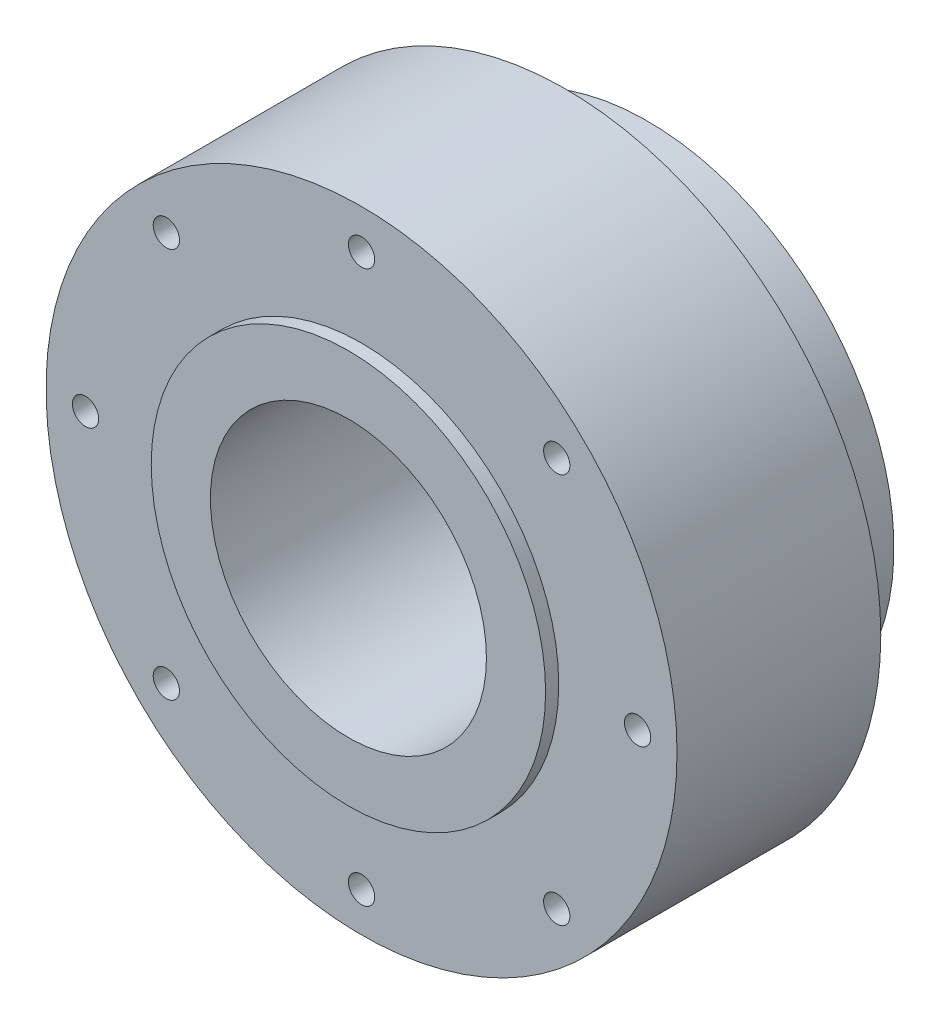
ISO-10303-21;
HEADER;
FILE_DESCRIPTION(('STEP AP214'),'2;1');
FILE_NAME('part.step','',(''),(''),'','','');
FILE_SCHEMA(('AUTOMOTIVE_DESIGN { 1 0 10303 214 1 1 1 1 }'));
ENDSEC;
DATA;
#1=APPLICATION_CONTEXT('core data for automotive mechanical design processes');
#2=APPLICATION_PROTOCOL_DEFINITION('international standard','automotive_design',2000,#1);
#3=PRODUCT_CONTEXT('',#1,'mechanical');
#4=PRODUCT('Part','Part','',(#3));
#5=PRODUCT_RELATED_PRODUCT_CATEGORY('part','',(#4));
#6=PRODUCT_DEFINITION_FORMATION('','',#4);
#7=PRODUCT_DEFINITION_CONTEXT('part definition',#1,'design');
#8=PRODUCT_DEFINITION('design','',#6,#7);
#9=PRODUCT_DEFINITION_SHAPE('','',#8);
#10=(LENGTH_UNIT() NAMED_UNIT(*) SI_UNIT(.MILLI.,.METRE.));
#11=(NAMED_UNIT(*) PLANE_ANGLE_UNIT() SI_UNIT($,.RADIAN.));
#12=(NAMED_UNIT(*) SI_UNIT($,.STERADIAN.) SOLID_ANGLE_UNIT());
#13=UNCERTAINTY_MEASURE_WITH_UNIT(LENGTH_MEASURE(1.E-05),#10,'distance_accuracy_value','');
#14=(GEOMETRIC_REPRESENTATION_CONTEXT(3) GLOBAL_UNCERTAINTY_ASSIGNED_CONTEXT((#13)) GLOBAL_UNIT_ASSIGNED_CONTEXT((#10,
#11,#12)) REPRESENTATION_CONTEXT('',''));
#15=CARTESIAN_POINT('',(0.,0.,0.));
#16=DIRECTION('',(0.,0.,1.));
#17=DIRECTION('',(1.,0.,0.));
#18=AXIS2_PLACEMENT_3D('',#15,#16,#17);
#19=CARTESIAN_POINT('',(0.,0.,31.));
#20=DIRECTION('',(0.,0.,-1.));
#21=DIRECTION('',(-1.,0.,0.));
#22=AXIS2_PLACEMENT_3D('',#19,#20,#21);
#23=CYLINDRICAL_SURFACE('',#22,48.);
#24=CARTESIAN_POINT('',(0.,0.,31.));
#25=DIRECTION('',(0.,0.,1.));
#26=DIRECTION('',(1.,0.,0.));
#27=AXIS2_PLACEMENT_3D('',#24,#25,#26);
#28=CIRCLE('',#27,48.);
#29=CARTESIAN_POINT('',(48.,0.,31.));
#30=VERTEX_POINT('',#29);
#31=EDGE_CURVE('E47',#30,#30,#28,.T.);
#32=ORIENTED_EDGE('',*,*,#31,.F.);
#33=EDGE_LOOP('',(#32));
#34=FACE_BOUND('',#33,.T.);
#35=CARTESIAN_POINT('',(0.,0.,0.));
#36=DIRECTION('',(0.,0.,1.));
#37=DIRECTION('',(1.,0.,0.));
#38=AXIS2_PLACEMENT_3D('',#35,#36,#37);
#39=CIRCLE('',#38,48.);
#40=CARTESIAN_POINT('',(48.,0.,0.));
#41=VERTEX_POINT('',#40);
#42=EDGE_CURVE('E43',#41,#41,#39,.T.);
#43=ORIENTED_EDGE('',*,*,#42,.T.);
#44=EDGE_LOOP('',(#43));
#45=FACE_BOUND('',#44,.T.);
#46=ADVANCED_FACE('F40',(#34,#45),#23,.T.);
#47=CARTESIAN_POINT('',(0.,0.,31.));
#48=DIRECTION('',(0.,0.,1.));
#49=DIRECTION('',(1.,0.,0.));
#50=AXIS2_PLACEMENT_3D('',#47,#48,#49);
#51=PLANE('',#50);
#52=CARTESIAN_POINT('',(0.,0.,31.));
#53=DIRECTION('',(0.,0.,1.));
#54=DIRECTION('',(1.,0.,0.));
#55=AXIS2_PLACEMENT_3D('',#52,#53,#54);
#56=CIRCLE('',#55,30.);
#57=CARTESIAN_POINT('',(30.,0.,31.));
#58=VERTEX_POINT('',#57);
#59=EDGE_CURVE('E60',#58,#58,#56,.T.);
#60=ORIENTED_EDGE('',*,*,#59,.F.);
#61=EDGE_LOOP('',(#60));
#62=FACE_BOUND('',#61,.T.);
#63=CARTESIAN_POINT('',(0.,42.,31.));
#64=DIRECTION('',(0.,0.,1.));
#65=DIRECTION('',(1.,0.,0.));
#66=AXIS2_PLACEMENT_3D('',#63,#64,#65);
#67=CIRCLE('',#66,2.);
#68=CARTESIAN_POINT('',(2.,42.,31.));
#69=VERTEX_POINT('',#68);
#70=EDGE_CURVE('E66',#69,#69,#67,.T.);
#71=ORIENTED_EDGE('',*,*,#70,.F.);
#72=EDGE_LOOP('',(#71));
#73=FACE_BOUND('',#72,.T.);
#74=CARTESIAN_POINT('',(29.698484809836,29.6984848098375,31.));
#75=DIRECTION('',(0.,0.,1.));
#76=DIRECTION('',(1.,0.,0.));
#77=AXIS2_PLACEMENT_3D('',#74,#75,#76);
#78=CIRCLE('',#77,2.00000000000033);
#79=CARTESIAN_POINT('',(31.6984848098364,29.6984848098375,31.));
#80=VERTEX_POINT('',#79);
#81=EDGE_CURVE('E69',#80,#80,#78,.T.);
#82=ORIENTED_EDGE('',*,*,#81,.F.);
#83=EDGE_LOOP('',(#82));
#84=FACE_BOUND('',#83,.T.);
#85=CARTESIAN_POINT('',(42.0000000000036,3.57342011339628E-12,31.));
#86=DIRECTION('',(0.,0.,1.));
#87=DIRECTION('',(1.,0.,0.));
#88=AXIS2_PLACEMENT_3D('',#85,#86,#87);
#89=CIRCLE('',#88,2.00000000000251);
#90=CARTESIAN_POINT('',(44.0000000000061,3.57342011339628E-12,31.));
#91=VERTEX_POINT('',#90);
#92=EDGE_CURVE('E75',#91,#91,#89,.T.);
#93=ORIENTED_EDGE('',*,*,#92,.F.);
#94=EDGE_LOOP('',(#93));
#95=FACE_BOUND('',#94,.T.);
#96=CARTESIAN_POINT('',(29.6984848098411,-29.6984848098325,31.));
#97=DIRECTION('',(0.,0.,1.));
#98=DIRECTION('',(1.,0.,0.));
#99=AXIS2_PLACEMENT_3D('',#96,#97,#98);
#100=CIRCLE('',#99,2.00000000000532);
#101=CARTESIAN_POINT('',(31.6984848098464,-29.6984848098325,31.));
#102=VERTEX_POINT('',#101);
#103=EDGE_CURVE('E81',#102,#102,#100,.T.);
#104=ORIENTED_EDGE('',*,*,#103,.F.);
#105=EDGE_LOOP('',(#104));
#106=FACE_BOUND('',#105,.T.);
#107=CARTESIAN_POINT('',(7.14684022679255E-12,-42.,31.));
#108=DIRECTION('',(0.,0.,1.));
#109=DIRECTION('',(1.,0.,0.));
#110=AXIS2_PLACEMENT_3D('',#107,#108,#109);
#111=CIRCLE('',#110,2.00000000000712);
#112=CARTESIAN_POINT('',(2.00000000001426,-42.,31.));
#113=VERTEX_POINT('',#112);
#114=EDGE_CURVE('E87',#113,#113,#111,.T.);
#115=ORIENTED_EDGE('',*,*,#114,.F.);
#116=EDGE_LOOP('',(#115));
#117=FACE_BOUND('',#116,.T.);
#118=CARTESIAN_POINT('',(-29.6984848098289,-29.6984848098375,31.));
#119=DIRECTION('',(0.,0.,1.));
#120=DIRECTION('',(1.,0.,0.));
#121=AXIS2_PLACEMENT_3D('',#118,#119,#120);
#122=CIRCLE('',#121,2.00000000000694);
#123=CARTESIAN_POINT('',(-27.698484809822,-29.6984848098375,31.));
#124=VERTEX_POINT('',#123);
#125=EDGE_CURVE('E93',#124,#124,#122,.T.);
#126=ORIENTED_EDGE('',*,*,#125,.F.);
#127=EDGE_LOOP('',(#126));
#128=FACE_BOUND('',#127,.T.);
#129=CARTESIAN_POINT('',(-41.9999999999964,-3.5785636299527E-12,31.));
#130=DIRECTION('',(0.,0.,1.));
#131=DIRECTION('',(1.,0.,0.));
#132=AXIS2_PLACEMENT_3D('',#129,#130,#131);
#133=CIRCLE('',#132,2.00000000000489);
#134=CARTESIAN_POINT('',(-39.9999999999915,-3.5785636299527E-12,31.));
#135=VERTEX_POINT('',#134);
#136=EDGE_CURVE('E99',#135,#135,#133,.T.);
#137=ORIENTED_EDGE('',*,*,#136,.F.);
#138=EDGE_LOOP('',(#137));
#139=FACE_BOUND('',#138,.T.);
#140=CARTESIAN_POINT('',(-29.698484809834,29.6984848098325,31.));
#141=DIRECTION('',(0.,0.,1.));
#142=DIRECTION('',(1.,0.,0.));
#143=AXIS2_PLACEMENT_3D('',#140,#141,#142);
#144=CIRCLE('',#143,2.00000000000225);
#145=CARTESIAN_POINT('',(-27.6984848098317,29.6984848098325,31.));
#146=VERTEX_POINT('',#145);
#147=EDGE_CURVE('E105',#146,#146,#144,.T.);
#148=ORIENTED_EDGE('',*,*,#147,.F.);
#149=EDGE_LOOP('',(#148));
#150=FACE_BOUND('',#149,.T.);
#151=ORIENTED_EDGE('',*,*,#31,.T.);
#152=EDGE_LOOP('',(#151));
#153=FACE_BOUND('',#152,.T.);
#154=ADVANCED_FACE('F120',(#62,#73,#84,#95,#106,#117,#128,#139,#150,#153),#51,.T.);
#155=CARTESIAN_POINT('',(0.,0.,0.));
#156=DIRECTION('',(0.,0.,1.));
#157=DIRECTION('',(1.,0.,0.));
#158=AXIS2_PLACEMENT_3D('',#155,#156,#157);
#159=PLANE('',#158);
#160=CARTESIAN_POINT('',(0.,42.,0.));
#161=DIRECTION('',(0.,0.,-1.));
#162=DIRECTION('',(-1.,0.,0.));
#163=AXIS2_PLACEMENT_3D('',#160,#161,#162);
#164=CIRCLE('',#163,2.);
#165=CARTESIAN_POINT('',(-2.,42.,0.));
#166=VERTEX_POINT('',#165);
#167=EDGE_CURVE('E290',#166,#166,#164,.T.);
#168=ORIENTED_EDGE('',*,*,#167,.F.);
#169=EDGE_LOOP('',(#168));
#170=FACE_BOUND('',#169,.T.);
#171=CARTESIAN_POINT('',(-29.6984848098355,29.6984848098363,0.));
#172=DIRECTION('',(0.,0.,-1.));
#173=DIRECTION('',(-1.,0.,0.));
#174=AXIS2_PLACEMENT_3D('',#171,#172,#173);
#175=CIRCLE('',#174,2.0000000000002);
#176=CARTESIAN_POINT('',(-31.6984848098357,29.6984848098363,0.));
#177=VERTEX_POINT('',#176);
#178=EDGE_CURVE('E295',#177,#177,#175,.T.);
#179=ORIENTED_EDGE('',*,*,#178,.F.);
#180=EDGE_LOOP('',(#179));
#181=FACE_BOUND('',#180,.T.);
#182=CARTESIAN_POINT('',(-42.0000000000018,1.78285241928082E-12,0.));
#183=DIRECTION('',(0.,0.,-1.));
#184=DIRECTION('',(-1.,0.,0.));
#185=AXIS2_PLACEMENT_3D('',#182,#183,#184);
#186=CIRCLE('',#185,2.00000000000132);
#187=CARTESIAN_POINT('',(-44.0000000000031,1.78285241928082E-12,0.));
#188=VERTEX_POINT('',#187);
#189=EDGE_CURVE('E303',#188,#188,#186,.T.);
#190=ORIENTED_EDGE('',*,*,#189,.F.);
#191=EDGE_LOOP('',(#190));
#192=FACE_BOUND('',#191,.T.);
#193=CARTESIAN_POINT('',(-29.698484809838,-29.6984848098337,0.));
#194=DIRECTION('',(0.,0.,-1.));
#195=DIRECTION('',(-1.,0.,0.));
#196=AXIS2_PLACEMENT_3D('',#193,#194,#195);
#197=CIRCLE('',#196,2.00000000000276);
#198=CARTESIAN_POINT('',(-31.6984848098408,-29.6984848098337,0.));
#199=VERTEX_POINT('',#198);
#200=EDGE_CURVE('E309',#199,#199,#197,.T.);
#201=ORIENTED_EDGE('',*,*,#200,.F.);
#202=EDGE_LOOP('',(#201));
#203=FACE_BOUND('',#202,.T.);
#204=CARTESIAN_POINT('',(-3.56570483856165E-12,-42.,0.));
#205=DIRECTION('',(0.,0.,-1.));
#206=DIRECTION('',(-1.,0.,0.));
#207=AXIS2_PLACEMENT_3D('',#204,#205,#206);
#208=CIRCLE('',#207,2.00000000000369);
#209=CARTESIAN_POINT('',(-2.00000000000726,-42.,0.));
#210=VERTEX_POINT('',#209);
#211=EDGE_CURVE('E315',#210,#210,#208,.T.);
#212=ORIENTED_EDGE('',*,*,#211,.F.);
#213=EDGE_LOOP('',(#212));
#214=FACE_BOUND('',#213,.T.);
#215=CARTESIAN_POINT('',(29.698484809832,-29.6984848098363,0.));
#216=DIRECTION('',(0.,0.,-1.));
#217=DIRECTION('',(-1.,0.,0.));
#218=AXIS2_PLACEMENT_3D('',#215,#216,#217);
#219=CIRCLE('',#218,2.00000000000365);
#220=CARTESIAN_POINT('',(27.6984848098283,-29.6984848098363,0.));
#221=VERTEX_POINT('',#220);
#222=EDGE_CURVE('E321',#221,#221,#219,.T.);
#223=ORIENTED_EDGE('',*,*,#222,.F.);
#224=EDGE_LOOP('',(#223));
#225=FACE_BOUND('',#224,.T.);
#226=CARTESIAN_POINT('',(41.9999999999982,-1.78799593583724E-12,0.));
#227=DIRECTION('',(0.,0.,-1.));
#228=DIRECTION('',(-1.,0.,0.));
#229=AXIS2_PLACEMENT_3D('',#226,#227,#228);
#230=CIRCLE('',#229,2.00000000000265);
#231=CARTESIAN_POINT('',(39.9999999999956,-1.78799593583724E-12,0.));
#232=VERTEX_POINT('',#231);
#233=EDGE_CURVE('E327',#232,#232,#230,.T.);
#234=ORIENTED_EDGE('',*,*,#233,.F.);
#235=EDGE_LOOP('',(#234));
#236=FACE_BOUND('',#235,.T.);
#237=CARTESIAN_POINT('',(29.6984848098345,29.6984848098337,0.));
#238=DIRECTION('',(0.,0.,-1.));
#239=DIRECTION('',(-1.,0.,0.));
#240=AXIS2_PLACEMENT_3D('',#237,#238,#239);
#241=CIRCLE('',#240,2.00000000000137);
#242=CARTESIAN_POINT('',(27.6984848098331,29.6984848098337,0.));
#243=VERTEX_POINT('',#242);
#244=EDGE_CURVE('E333',#243,#243,#241,.T.);
#245=ORIENTED_EDGE('',*,*,#244,.F.);
#246=EDGE_LOOP('',(#245));
#247=FACE_BOUND('',#246,.T.);
#248=CARTESIAN_POINT('',(0.,0.,0.));
#249=DIRECTION('',(0.,0.,-1.));
#250=DIRECTION('',(-1.,0.,0.));
#251=AXIS2_PLACEMENT_3D('',#248,#249,#250);
#252=CIRCLE('',#251,37.5);
#253=CARTESIAN_POINT('',(-37.5,0.,0.));
#254=VERTEX_POINT('',#253);
#255=EDGE_CURVE('E10',#254,#254,#252,.T.);
#256=ORIENTED_EDGE('',*,*,#255,.F.);
#257=EDGE_LOOP('',(#256));
#258=FACE_BOUND('',#257,.T.);
#259=ORIENTED_EDGE('',*,*,#42,.F.);
#260=EDGE_LOOP('',(#259));
#261=FACE_BOUND('',#260,.T.);
#262=ADVANCED_FACE('F116',(#170,#181,#192,#203,#214,#225,#236,#247,#258,#261),#159,.F.);
#263=CARTESIAN_POINT('',(-29.698484809834,29.6984848098325,27.5));
#264=DIRECTION('',(0.,0.,1.));
#265=DIRECTION('',(1.,0.,0.));
#266=AXIS2_PLACEMENT_3D('',#263,#264,#265);
#267=CYLINDRICAL_SURFACE('',#266,2.00000000000225);
#268=CARTESIAN_POINT('',(-29.698484809834,29.6984848098325,27.5));
#269=DIRECTION('',(0.,0.,1.));
#270=DIRECTION('',(1.,0.,0.));
#271=AXIS2_PLACEMENT_3D('',#268,#269,#270);
#272=CIRCLE('',#271,2.00000000000225);
#273=CARTESIAN_POINT('',(-27.6984848098317,29.6984848098325,27.5));
#274=VERTEX_POINT('',#273);
#275=EDGE_CURVE('E59',#274,#274,#272,.T.);
#276=ORIENTED_EDGE('',*,*,#275,.F.);
#277=EDGE_LOOP('',(#276));
#278=FACE_BOUND('',#277,.T.);
#279=ORIENTED_EDGE('',*,*,#147,.T.);
#280=EDGE_LOOP('',(#279));
#281=FACE_BOUND('',#280,.T.);
#282=ADVANCED_FACE('F113',(#278,#281),#267,.F.);
#283=CARTESIAN_POINT('',(-29.698484809834,29.6984848098325,27.5));
#284=DIRECTION('',(0.,0.,1.));
#285=DIRECTION('',(1.,0.,0.));
#286=AXIS2_PLACEMENT_3D('',#283,#284,#285);
#287=PLANE('',#286);
#288=ORIENTED_EDGE('',*,*,#275,.T.);
#289=EDGE_LOOP('',(#288));
#290=FACE_BOUND('',#289,.T.);
#291=ADVANCED_FACE('F111',(#290),#287,.T.);
#292=CARTESIAN_POINT('',(-41.9999999999964,-3.5785636299527E-12,27.5));
#293=DIRECTION('',(0.,0.,1.));
#294=DIRECTION('',(1.,0.,0.));
#295=AXIS2_PLACEMENT_3D('',#292,#293,#294);
#296=CYLINDRICAL_SURFACE('',#295,2.00000000000489);
#297=CARTESIAN_POINT('',(-41.9999999999964,-3.5785636299527E-12,27.5));
#298=DIRECTION('',(0.,0.,1.));
#299=DIRECTION('',(1.,0.,0.));
#300=AXIS2_PLACEMENT_3D('',#297,#298,#299);
#301=CIRCLE('',#300,2.00000000000489);
#302=CARTESIAN_POINT('',(-39.9999999999915,-3.5785636299527E-12,27.5));
#303=VERTEX_POINT('',#302);
#304=EDGE_CURVE('E102',#303,#303,#301,.T.);
#305=ORIENTED_EDGE('',*,*,#304,.F.);
#306=EDGE_LOOP('',(#305));
#307=FACE_BOUND('',#306,.T.);
#308=ORIENTED_EDGE('',*,*,#136,.T.);
#309=EDGE_LOOP('',(#308));
#310=FACE_BOUND('',#309,.T.);
#311=ADVANCED_FACE('F140',(#307,#310),#296,.F.);
#312=CARTESIAN_POINT('',(-41.9999999999964,-3.5785636299527E-12,27.5));
#313=DIRECTION('',(0.,0.,1.));
#314=DIRECTION('',(1.,0.,0.));
#315=AXIS2_PLACEMENT_3D('',#312,#313,#314);
#316=PLANE('',#315);
#317=ORIENTED_EDGE('',*,*,#304,.T.);
#318=EDGE_LOOP('',(#317));
#319=FACE_BOUND('',#318,.T.);
#320=ADVANCED_FACE('F142',(#319),#316,.T.);
#321=CARTESIAN_POINT('',(-29.6984848098289,-29.6984848098375,27.5));
#322=DIRECTION('',(0.,0.,1.));
#323=DIRECTION('',(1.,0.,0.));
#324=AXIS2_PLACEMENT_3D('',#321,#322,#323);
#325=CYLINDRICAL_SURFACE('',#324,2.00000000000694);
#326=CARTESIAN_POINT('',(-29.6984848098289,-29.6984848098375,27.5));
#327=DIRECTION('',(0.,0.,1.));
#328=DIRECTION('',(1.,0.,0.));
#329=AXIS2_PLACEMENT_3D('',#326,#327,#328);
#330=CIRCLE('',#329,2.00000000000694);
#331=CARTESIAN_POINT('',(-27.698484809822,-29.6984848098375,27.5));
#332=VERTEX_POINT('',#331);
#333=EDGE_CURVE('E96',#332,#332,#330,.T.);
#334=ORIENTED_EDGE('',*,*,#333,.F.);
#335=EDGE_LOOP('',(#334));
#336=FACE_BOUND('',#335,.T.);
#337=ORIENTED_EDGE('',*,*,#125,.T.);
#338=EDGE_LOOP('',(#337));
#339=FACE_BOUND('',#338,.T.);
#340=ADVANCED_FACE('F145',(#336,#339),#325,.F.);
#341=CARTESIAN_POINT('',(-29.6984848098289,-29.6984848098375,27.5));
#342=DIRECTION('',(0.,0.,1.));
#343=DIRECTION('',(1.,0.,0.));
#344=AXIS2_PLACEMENT_3D('',#341,#342,#343);
#345=PLANE('',#344);
#346=ORIENTED_EDGE('',*,*,#333,.T.);
#347=EDGE_LOOP('',(#346));
#348=FACE_BOUND('',#347,.T.);
#349=ADVANCED_FACE('F150',(#348),#345,.T.);
#350=CARTESIAN_POINT('',(7.14684022679255E-12,-42.,27.5));
#351=DIRECTION('',(0.,0.,1.));
#352=DIRECTION('',(1.,0.,0.));
#353=AXIS2_PLACEMENT_3D('',#350,#351,#352);
#354=CYLINDRICAL_SURFACE('',#353,2.00000000000712);
#355=CARTESIAN_POINT('',(7.14684022679255E-12,-42.,27.5));
#356=DIRECTION('',(0.,0.,1.));
#357=DIRECTION('',(1.,0.,0.));
#358=AXIS2_PLACEMENT_3D('',#355,#356,#357);
#359=CIRCLE('',#358,2.00000000000712);
#360=CARTESIAN_POINT('',(2.00000000001426,-42.,27.5));
#361=VERTEX_POINT('',#360);
#362=EDGE_CURVE('E90',#361,#361,#359,.T.);
#363=ORIENTED_EDGE('',*,*,#362,.F.);
#364=EDGE_LOOP('',(#363));
#365=FACE_BOUND('',#364,.T.);
#366=ORIENTED_EDGE('',*,*,#114,.T.);
#367=EDGE_LOOP('',(#366));
#368=FACE_BOUND('',#367,.T.);
#369=ADVANCED_FACE('F153',(#365,#368),#354,.F.);
#370=CARTESIAN_POINT('',(7.14684022679255E-12,-42.,27.5));
#371=DIRECTION('',(0.,0.,1.));
#372=DIRECTION('',(1.,0.,0.));
#373=AXIS2_PLACEMENT_3D('',#370,#371,#372);
#374=PLANE('',#373);
#375=ORIENTED_EDGE('',*,*,#362,.T.);
#376=EDGE_LOOP('',(#375));
#377=FACE_BOUND('',#376,.T.);
#378=ADVANCED_FACE('F158',(#377),#374,.T.);
#379=CARTESIAN_POINT('',(29.6984848098411,-29.6984848098325,27.5));
#380=DIRECTION('',(0.,0.,1.));
#381=DIRECTION('',(1.,0.,0.));
#382=AXIS2_PLACEMENT_3D('',#379,#380,#381);
#383=CYLINDRICAL_SURFACE('',#382,2.00000000000532);
#384=CARTESIAN_POINT('',(29.6984848098411,-29.6984848098325,27.5));
#385=DIRECTION('',(0.,0.,1.));
#386=DIRECTION('',(1.,0.,0.));
#387=AXIS2_PLACEMENT_3D('',#384,#385,#386);
#388=CIRCLE('',#387,2.00000000000532);
#389=CARTESIAN_POINT('',(31.6984848098464,-29.6984848098325,27.5));
#390=VERTEX_POINT('',#389);
#391=EDGE_CURVE('E84',#390,#390,#388,.T.);
#392=ORIENTED_EDGE('',*,*,#391,.F.);
#393=EDGE_LOOP('',(#392));
#394=FACE_BOUND('',#393,.T.);
#395=ORIENTED_EDGE('',*,*,#103,.T.);
#396=EDGE_LOOP('',(#395));
#397=FACE_BOUND('',#396,.T.);
#398=ADVANCED_FACE('F161',(#394,#397),#383,.F.);
#399=CARTESIAN_POINT('',(29.6984848098411,-29.6984848098325,27.5));
#400=DIRECTION('',(0.,0.,1.));
#401=DIRECTION('',(1.,0.,0.));
#402=AXIS2_PLACEMENT_3D('',#399,#400,#401);
#403=PLANE('',#402);
#404=ORIENTED_EDGE('',*,*,#391,.T.);
#405=EDGE_LOOP('',(#404));
#406=FACE_BOUND('',#405,.T.);
#407=ADVANCED_FACE('F166',(#406),#403,.T.);
#408=CARTESIAN_POINT('',(42.0000000000036,3.57342011339628E-12,27.5));
#409=DIRECTION('',(0.,0.,1.));
#410=DIRECTION('',(1.,0.,0.));
#411=AXIS2_PLACEMENT_3D('',#408,#409,#410);
#412=CYLINDRICAL_SURFACE('',#411,2.00000000000251);
#413=CARTESIAN_POINT('',(42.0000000000036,3.57342011339628E-12,27.5));
#414=DIRECTION('',(0.,0.,1.));
#415=DIRECTION('',(1.,0.,0.));
#416=AXIS2_PLACEMENT_3D('',#413,#414,#415);
#417=CIRCLE('',#416,2.00000000000251);
#418=CARTESIAN_POINT('',(44.0000000000061,3.57342011339628E-12,27.5));
#419=VERTEX_POINT('',#418);
#420=EDGE_CURVE('E78',#419,#419,#417,.T.);
#421=ORIENTED_EDGE('',*,*,#420,.F.);
#422=EDGE_LOOP('',(#421));
#423=FACE_BOUND('',#422,.T.);
#424=ORIENTED_EDGE('',*,*,#92,.T.);
#425=EDGE_LOOP('',(#424));
#426=FACE_BOUND('',#425,.T.);
#427=ADVANCED_FACE('F169',(#423,#426),#412,.F.);
#428=CARTESIAN_POINT('',(42.0000000000036,3.57342011339628E-12,27.5));
#429=DIRECTION('',(0.,0.,1.));
#430=DIRECTION('',(1.,0.,0.));
#431=AXIS2_PLACEMENT_3D('',#428,#429,#430);
#432=PLANE('',#431);
#433=ORIENTED_EDGE('',*,*,#420,.T.);
#434=EDGE_LOOP('',(#433));
#435=FACE_BOUND('',#434,.T.);
#436=ADVANCED_FACE('F174',(#435),#432,.T.);
#437=CARTESIAN_POINT('',(29.698484809836,29.6984848098375,27.5));
#438=DIRECTION('',(0.,0.,1.));
#439=DIRECTION('',(1.,0.,0.));
#440=AXIS2_PLACEMENT_3D('',#437,#438,#439);
#441=CYLINDRICAL_SURFACE('',#440,2.00000000000033);
#442=CARTESIAN_POINT('',(29.698484809836,29.6984848098375,27.5));
#443=DIRECTION('',(0.,0.,1.));
#444=DIRECTION('',(1.,0.,0.));
#445=AXIS2_PLACEMENT_3D('',#442,#443,#444);
#446=CIRCLE('',#445,2.00000000000033);
#447=CARTESIAN_POINT('',(31.6984848098364,29.6984848098375,27.5));
#448=VERTEX_POINT('',#447);
#449=EDGE_CURVE('E72',#448,#448,#446,.T.);
#450=ORIENTED_EDGE('',*,*,#449,.F.);
#451=EDGE_LOOP('',(#450));
#452=FACE_BOUND('',#451,.T.);
#453=ORIENTED_EDGE('',*,*,#81,.T.);
#454=EDGE_LOOP('',(#453));
#455=FACE_BOUND('',#454,.T.);
#456=ADVANCED_FACE('F177',(#452,#455),#441,.F.);
#457=CARTESIAN_POINT('',(29.698484809836,29.6984848098375,27.5));
#458=DIRECTION('',(0.,0.,1.));
#459=DIRECTION('',(1.,0.,0.));
#460=AXIS2_PLACEMENT_3D('',#457,#458,#459);
#461=PLANE('',#460);
#462=ORIENTED_EDGE('',*,*,#449,.T.);
#463=EDGE_LOOP('',(#462));
#464=FACE_BOUND('',#463,.T.);
#465=ADVANCED_FACE('F182',(#464),#461,.T.);
#466=CARTESIAN_POINT('',(0.,42.,27.5));
#467=DIRECTION('',(0.,0.,1.));
#468=DIRECTION('',(1.,0.,0.));
#469=AXIS2_PLACEMENT_3D('',#466,#467,#468);
#470=CYLINDRICAL_SURFACE('',#469,2.);
#471=CARTESIAN_POINT('',(0.,42.,27.5));
#472=DIRECTION('',(0.,0.,1.));
#473=DIRECTION('',(1.,0.,0.));
#474=AXIS2_PLACEMENT_3D('',#471,#472,#473);
#475=CIRCLE('',#474,2.);
#476=CARTESIAN_POINT('',(2.,42.,27.5));
#477=VERTEX_POINT('',#476);
#478=EDGE_CURVE('E63',#477,#477,#475,.T.);
#479=ORIENTED_EDGE('',*,*,#478,.F.);
#480=EDGE_LOOP('',(#479));
#481=FACE_BOUND('',#480,.T.);
#482=ORIENTED_EDGE('',*,*,#70,.T.);
#483=EDGE_LOOP('',(#482));
#484=FACE_BOUND('',#483,.T.);
#485=ADVANCED_FACE('F185',(#481,#484),#470,.F.);
#486=CARTESIAN_POINT('',(0.,42.,27.5));
#487=DIRECTION('',(0.,0.,1.));
#488=DIRECTION('',(1.,0.,0.));
#489=AXIS2_PLACEMENT_3D('',#486,#487,#488);
#490=PLANE('',#489);
#491=ORIENTED_EDGE('',*,*,#478,.T.);
#492=EDGE_LOOP('',(#491));
#493=FACE_BOUND('',#492,.T.);
#494=ADVANCED_FACE('F192',(#493),#490,.T.);
#495=CARTESIAN_POINT('',(0.,0.,33.));
#496=DIRECTION('',(0.,0.,-1.));
#497=DIRECTION('',(-1.,0.,0.));
#498=AXIS2_PLACEMENT_3D('',#495,#496,#497);
#499=CYLINDRICAL_SURFACE('',#498,30.);
#500=CARTESIAN_POINT('',(0.,0.,33.));
#501=DIRECTION('',(0.,0.,1.));
#502=DIRECTION('',(1.,0.,0.));
#503=AXIS2_PLACEMENT_3D('',#500,#501,#502);
#504=CIRCLE('',#503,30.);
#505=CARTESIAN_POINT('',(30.,0.,33.));
#506=VERTEX_POINT('',#505);
#507=EDGE_CURVE('E56',#506,#506,#504,.T.);
#508=ORIENTED_EDGE('',*,*,#507,.F.);
#509=EDGE_LOOP('',(#508));
#510=FACE_BOUND('',#509,.T.);
#511=ORIENTED_EDGE('',*,*,#59,.T.);
#512=EDGE_LOOP('',(#511));
#513=FACE_BOUND('',#512,.T.);
#514=ADVANCED_FACE('F196',(#510,#513),#499,.T.);
#515=CARTESIAN_POINT('',(0.,0.,33.));
#516=DIRECTION('',(0.,0.,1.));
#517=DIRECTION('',(1.,0.,0.));
#518=AXIS2_PLACEMENT_3D('',#515,#516,#517);
#519=PLANE('',#518);
#520=CARTESIAN_POINT('',(0.,0.,33.));
#521=DIRECTION('',(0.,0.,1.));
#522=DIRECTION('',(1.,0.,0.));
#523=AXIS2_PLACEMENT_3D('',#520,#521,#522);
#524=CIRCLE('',#523,21.);
#525=CARTESIAN_POINT('',(21.,0.,33.));
#526=VERTEX_POINT('',#525);
#527=EDGE_CURVE('E289',#526,#526,#524,.T.);
#528=ORIENTED_EDGE('',*,*,#527,.F.);
#529=EDGE_LOOP('',(#528));
#530=FACE_BOUND('',#529,.T.);
#531=ORIENTED_EDGE('',*,*,#507,.T.);
#532=EDGE_LOOP('',(#531));
#533=FACE_BOUND('',#532,.T.);
#534=ADVANCED_FACE('F200',(#530,#533),#519,.T.);
#535=CARTESIAN_POINT('',(0.,0.,-12.5));
#536=DIRECTION('',(0.,0.,1.));
#537=DIRECTION('',(1.,0.,0.));
#538=AXIS2_PLACEMENT_3D('',#535,#536,#537);
#539=CYLINDRICAL_SURFACE('',#538,37.5);
#540=CARTESIAN_POINT('',(0.,0.,-12.5));
#541=DIRECTION('',(0.,0.,-1.));
#542=DIRECTION('',(-1.,0.,0.));
#543=AXIS2_PLACEMENT_3D('',#540,#541,#542);
#544=CIRCLE('',#543,37.5);
#545=CARTESIAN_POINT('',(-37.5,0.,-12.5));
#546=VERTEX_POINT('',#545);
#547=EDGE_CURVE('E54',#546,#546,#544,.T.);
#548=ORIENTED_EDGE('',*,*,#547,.F.);
#549=EDGE_LOOP('',(#548));
#550=FACE_BOUND('',#549,.T.);
#551=ORIENTED_EDGE('',*,*,#255,.T.);
#552=EDGE_LOOP('',(#551));
#553=FACE_BOUND('',#552,.T.);
#554=ADVANCED_FACE('F204',(#550,#553),#539,.T.);
#555=CARTESIAN_POINT('',(0.,0.,-12.5));
#556=DIRECTION('',(0.,0.,-1.));
#557=DIRECTION('',(-1.,0.,0.));
#558=AXIS2_PLACEMENT_3D('',#555,#556,#557);
#559=PLANE('',#558);
#560=ORIENTED_EDGE('',*,*,#547,.T.);
#561=EDGE_LOOP('',(#560));
#562=FACE_BOUND('',#561,.T.);
#563=ADVANCED_FACE('F208',(#562),#559,.T.);
#564=CARTESIAN_POINT('',(0.,0.,0.));
#565=DIRECTION('',(0.,0.,1.));
#566=DIRECTION('',(1.,0.,0.));
#567=AXIS2_PLACEMENT_3D('',#564,#565,#566);
#568=CYLINDRICAL_SURFACE('',#567,21.);
#569=CARTESIAN_POINT('',(0.,0.,0.));
#570=DIRECTION('',(0.,0.,1.));
#571=DIRECTION('',(1.,0.,0.));
#572=AXIS2_PLACEMENT_3D('',#569,#570,#571);
#573=CIRCLE('',#572,21.);
#574=CARTESIAN_POINT('',(21.,0.,0.));
#575=VERTEX_POINT('',#574);
#576=EDGE_CURVE('E293',#575,#575,#573,.T.);
#577=ORIENTED_EDGE('',*,*,#576,.F.);
#578=EDGE_LOOP('',(#577));
#579=FACE_BOUND('',#578,.T.);
#580=ORIENTED_EDGE('',*,*,#527,.T.);
#581=EDGE_LOOP('',(#580));
#582=FACE_BOUND('',#581,.T.);
#583=ADVANCED_FACE('F212',(#579,#582),#568,.F.);
#584=CARTESIAN_POINT('',(0.,0.,0.));
#585=DIRECTION('',(0.,0.,1.));
#586=DIRECTION('',(1.,0.,0.));
#587=AXIS2_PLACEMENT_3D('',#584,#585,#586);
#588=PLANE('',#587);
#589=ORIENTED_EDGE('',*,*,#576,.T.);
#590=EDGE_LOOP('',(#589));
#591=FACE_BOUND('',#590,.T.);
#592=ADVANCED_FACE('F216',(#591),#588,.T.);
#593=CARTESIAN_POINT('',(29.6984848098345,29.6984848098337,3.5));
#594=DIRECTION('',(0.,0.,-1.));
#595=DIRECTION('',(-1.,0.,0.));
#596=AXIS2_PLACEMENT_3D('',#593,#594,#595);
#597=CYLINDRICAL_SURFACE('',#596,2.00000000000137);
#598=CARTESIAN_POINT('',(29.6984848098345,29.6984848098337,3.5));
#599=DIRECTION('',(0.,0.,-1.));
#600=DIRECTION('',(-1.,0.,0.));
#601=AXIS2_PLACEMENT_3D('',#598,#599,#600);
#602=CIRCLE('',#601,2.00000000000137);
#603=CARTESIAN_POINT('',(27.6984848098331,29.6984848098337,3.5));
#604=VERTEX_POINT('',#603);
#605=EDGE_CURVE('E336',#604,#604,#602,.T.);
#606=ORIENTED_EDGE('',*,*,#605,.F.);
#607=EDGE_LOOP('',(#606));
#608=FACE_BOUND('',#607,.T.);
#609=ORIENTED_EDGE('',*,*,#244,.T.);
#610=EDGE_LOOP('',(#609));
#611=FACE_BOUND('',#610,.T.);
#612=ADVANCED_FACE('F220',(#608,#611),#597,.F.);
#613=CARTESIAN_POINT('',(29.6984848098345,29.6984848098337,3.5));
#614=DIRECTION('',(0.,0.,-1.));
#615=DIRECTION('',(-1.,0.,0.));
#616=AXIS2_PLACEMENT_3D('',#613,#614,#615);
#617=PLANE('',#616);
#618=ORIENTED_EDGE('',*,*,#605,.T.);
#619=EDGE_LOOP('',(#618));
#620=FACE_BOUND('',#619,.T.);
#621=ADVANCED_FACE('F222',(#620),#617,.T.);
#622=CARTESIAN_POINT('',(41.9999999999982,-1.78799593583724E-12,3.5));
#623=DIRECTION('',(0.,0.,-1.));
#624=DIRECTION('',(-1.,0.,0.));
#625=AXIS2_PLACEMENT_3D('',#622,#623,#624);
#626=CYLINDRICAL_SURFACE('',#625,2.00000000000265);
#627=CARTESIAN_POINT('',(41.9999999999982,-1.78799593583724E-12,3.5));
#628=DIRECTION('',(0.,0.,-1.));
#629=DIRECTION('',(-1.,0.,0.));
#630=AXIS2_PLACEMENT_3D('',#627,#628,#629);
#631=CIRCLE('',#630,2.00000000000265);
#632=CARTESIAN_POINT('',(39.9999999999956,-1.78799593583724E-12,3.5));
#633=VERTEX_POINT('',#632);
#634=EDGE_CURVE('E330',#633,#633,#631,.T.);
#635=ORIENTED_EDGE('',*,*,#634,.F.);
#636=EDGE_LOOP('',(#635));
#637=FACE_BOUND('',#636,.T.);
#638=ORIENTED_EDGE('',*,*,#233,.T.);
#639=EDGE_LOOP('',(#638));
#640=FACE_BOUND('',#639,.T.);
#641=ADVANCED_FACE('F225',(#637,#640),#626,.F.);
#642=CARTESIAN_POINT('',(41.9999999999982,-1.78799593583724E-12,3.5));
#643=DIRECTION('',(0.,0.,-1.));
#644=DIRECTION('',(-1.,0.,0.));
#645=AXIS2_PLACEMENT_3D('',#642,#643,#644);
#646=PLANE('',#645);
#647=ORIENTED_EDGE('',*,*,#634,.T.);
#648=EDGE_LOOP('',(#647));
#649=FACE_BOUND('',#648,.T.);
#650=ADVANCED_FACE('F230',(#649),#646,.T.);
#651=CARTESIAN_POINT('',(29.698484809832,-29.6984848098363,3.5));
#652=DIRECTION('',(0.,0.,-1.));
#653=DIRECTION('',(-1.,0.,0.));
#654=AXIS2_PLACEMENT_3D('',#651,#652,#653);
#655=CYLINDRICAL_SURFACE('',#654,2.00000000000365);
#656=CARTESIAN_POINT('',(29.698484809832,-29.6984848098363,3.5));
#657=DIRECTION('',(0.,0.,-1.));
#658=DIRECTION('',(-1.,0.,0.));
#659=AXIS2_PLACEMENT_3D('',#656,#657,#658);
#660=CIRCLE('',#659,2.00000000000365);
#661=CARTESIAN_POINT('',(27.6984848098283,-29.6984848098363,3.5));
#662=VERTEX_POINT('',#661);
#663=EDGE_CURVE('E324',#662,#662,#660,.T.);
#664=ORIENTED_EDGE('',*,*,#663,.F.);
#665=EDGE_LOOP('',(#664));
#666=FACE_BOUND('',#665,.T.);
#667=ORIENTED_EDGE('',*,*,#222,.T.);
#668=EDGE_LOOP('',(#667));
#669=FACE_BOUND('',#668,.T.);
#670=ADVANCED_FACE('F233',(#666,#669),#655,.F.);
#671=CARTESIAN_POINT('',(29.698484809832,-29.6984848098363,3.5));
#672=DIRECTION('',(0.,0.,-1.));
#673=DIRECTION('',(-1.,0.,0.));
#674=AXIS2_PLACEMENT_3D('',#671,#672,#673);
#675=PLANE('',#674);
#676=ORIENTED_EDGE('',*,*,#663,.T.);
#677=EDGE_LOOP('',(#676));
#678=FACE_BOUND('',#677,.T.);
#679=ADVANCED_FACE('F238',(#678),#675,.T.);
#680=CARTESIAN_POINT('',(-3.56570483856165E-12,-42.,3.5));
#681=DIRECTION('',(0.,0.,-1.));
#682=DIRECTION('',(-1.,0.,0.));
#683=AXIS2_PLACEMENT_3D('',#680,#681,#682);
#684=CYLINDRICAL_SURFACE('',#683,2.00000000000369);
#685=CARTESIAN_POINT('',(-3.56570483856165E-12,-42.,3.5));
#686=DIRECTION('',(0.,0.,-1.));
#687=DIRECTION('',(-1.,0.,0.));
#688=AXIS2_PLACEMENT_3D('',#685,#686,#687);
#689=CIRCLE('',#688,2.00000000000369);
#690=CARTESIAN_POINT('',(-2.00000000000726,-42.,3.5));
#691=VERTEX_POINT('',#690);
#692=EDGE_CURVE('E318',#691,#691,#689,.T.);
#693=ORIENTED_EDGE('',*,*,#692,.F.);
#694=EDGE_LOOP('',(#693));
#695=FACE_BOUND('',#694,.T.);
#696=ORIENTED_EDGE('',*,*,#211,.T.);
#697=EDGE_LOOP('',(#696));
#698=FACE_BOUND('',#697,.T.);
#699=ADVANCED_FACE('F241',(#695,#698),#684,.F.);
#700=CARTESIAN_POINT('',(-3.56570483856165E-12,-42.,3.5));
#701=DIRECTION('',(0.,0.,-1.));
#702=DIRECTION('',(-1.,0.,0.));
#703=AXIS2_PLACEMENT_3D('',#700,#701,#702);
#704=PLANE('',#703);
#705=ORIENTED_EDGE('',*,*,#692,.T.);
#706=EDGE_LOOP('',(#705));
#707=FACE_BOUND('',#706,.T.);
#708=ADVANCED_FACE('F246',(#707),#704,.T.);
#709=CARTESIAN_POINT('',(-29.698484809838,-29.6984848098337,3.5));
#710=DIRECTION('',(0.,0.,-1.));
#711=DIRECTION('',(-1.,0.,0.));
#712=AXIS2_PLACEMENT_3D('',#709,#710,#711);
#713=CYLINDRICAL_SURFACE('',#712,2.00000000000276);
#714=CARTESIAN_POINT('',(-29.698484809838,-29.6984848098337,3.5));
#715=DIRECTION('',(0.,0.,-1.));
#716=DIRECTION('',(-1.,0.,0.));
#717=AXIS2_PLACEMENT_3D('',#714,#715,#716);
#718=CIRCLE('',#717,2.00000000000276);
#719=CARTESIAN_POINT('',(-31.6984848098408,-29.6984848098337,3.5));
#720=VERTEX_POINT('',#719);
#721=EDGE_CURVE('E312',#720,#720,#718,.T.);
#722=ORIENTED_EDGE('',*,*,#721,.F.);
#723=EDGE_LOOP('',(#722));
#724=FACE_BOUND('',#723,.T.);
#725=ORIENTED_EDGE('',*,*,#200,.T.);
#726=EDGE_LOOP('',(#725));
#727=FACE_BOUND('',#726,.T.);
#728=ADVANCED_FACE('F249',(#724,#727),#713,.F.);
#729=CARTESIAN_POINT('',(-29.698484809838,-29.6984848098337,3.5));
#730=DIRECTION('',(0.,0.,-1.));
#731=DIRECTION('',(-1.,0.,0.));
#732=AXIS2_PLACEMENT_3D('',#729,#730,#731);
#733=PLANE('',#732);
#734=ORIENTED_EDGE('',*,*,#721,.T.);
#735=EDGE_LOOP('',(#734));
#736=FACE_BOUND('',#735,.T.);
#737=ADVANCED_FACE('F254',(#736),#733,.T.);
#738=CARTESIAN_POINT('',(-42.0000000000018,1.78285241928082E-12,3.5));
#739=DIRECTION('',(0.,0.,-1.));
#740=DIRECTION('',(-1.,0.,0.));
#741=AXIS2_PLACEMENT_3D('',#738,#739,#740);
#742=CYLINDRICAL_SURFACE('',#741,2.00000000000132);
#743=CARTESIAN_POINT('',(-42.0000000000018,1.78285241928082E-12,3.5));
#744=DIRECTION('',(0.,0.,-1.));
#745=DIRECTION('',(-1.,0.,0.));
#746=AXIS2_PLACEMENT_3D('',#743,#744,#745);
#747=CIRCLE('',#746,2.00000000000132);
#748=CARTESIAN_POINT('',(-44.0000000000031,1.78285241928082E-12,3.5));
#749=VERTEX_POINT('',#748);
#750=EDGE_CURVE('E306',#749,#749,#747,.T.);
#751=ORIENTED_EDGE('',*,*,#750,.F.);
#752=EDGE_LOOP('',(#751));
#753=FACE_BOUND('',#752,.T.);
#754=ORIENTED_EDGE('',*,*,#189,.T.);
#755=EDGE_LOOP('',(#754));
#756=FACE_BOUND('',#755,.T.);
#757=ADVANCED_FACE('F257',(#753,#756),#742,.F.);
#758=CARTESIAN_POINT('',(-42.0000000000018,1.78285241928082E-12,3.5));
#759=DIRECTION('',(0.,0.,-1.));
#760=DIRECTION('',(-1.,0.,0.));
#761=AXIS2_PLACEMENT_3D('',#758,#759,#760);
#762=PLANE('',#761);
#763=ORIENTED_EDGE('',*,*,#750,.T.);
#764=EDGE_LOOP('',(#763));
#765=FACE_BOUND('',#764,.T.);
#766=ADVANCED_FACE('F262',(#765),#762,.T.);
#767=CARTESIAN_POINT('',(-29.6984848098355,29.6984848098363,3.5));
#768=DIRECTION('',(0.,0.,-1.));
#769=DIRECTION('',(-1.,0.,0.));
#770=AXIS2_PLACEMENT_3D('',#767,#768,#769);
#771=CYLINDRICAL_SURFACE('',#770,2.0000000000002);
#772=CARTESIAN_POINT('',(-29.6984848098355,29.6984848098363,3.5));
#773=DIRECTION('',(0.,0.,-1.));
#774=DIRECTION('',(-1.,0.,0.));
#775=AXIS2_PLACEMENT_3D('',#772,#773,#774);
#776=CIRCLE('',#775,2.0000000000002);
#777=CARTESIAN_POINT('',(-31.6984848098357,29.6984848098363,3.5));
#778=VERTEX_POINT('',#777);
#779=EDGE_CURVE('E300',#778,#778,#776,.T.);
#780=ORIENTED_EDGE('',*,*,#779,.F.);
#781=EDGE_LOOP('',(#780));
#782=FACE_BOUND('',#781,.T.);
#783=ORIENTED_EDGE('',*,*,#178,.T.);
#784=EDGE_LOOP('',(#783));
#785=FACE_BOUND('',#784,.T.);
#786=ADVANCED_FACE('F265',(#782,#785),#771,.F.);
#787=CARTESIAN_POINT('',(-29.6984848098355,29.6984848098363,3.5));
#788=DIRECTION('',(0.,0.,-1.));
#789=DIRECTION('',(-1.,0.,0.));
#790=AXIS2_PLACEMENT_3D('',#787,#788,#789);
#791=PLANE('',#790);
#792=ORIENTED_EDGE('',*,*,#779,.T.);
#793=EDGE_LOOP('',(#792));
#794=FACE_BOUND('',#793,.T.);
#795=ADVANCED_FACE('F270',(#794),#791,.T.);
#796=CARTESIAN_POINT('',(0.,42.,3.5));
#797=DIRECTION('',(0.,0.,-1.));
#798=DIRECTION('',(-1.,0.,0.));
#799=AXIS2_PLACEMENT_3D('',#796,#797,#798);
#800=CYLINDRICAL_SURFACE('',#799,2.);
#801=CARTESIAN_POINT('',(0.,42.,3.5));
#802=DIRECTION('',(0.,0.,-1.));
#803=DIRECTION('',(-1.,0.,0.));
#804=AXIS2_PLACEMENT_3D('',#801,#802,#803);
#805=CIRCLE('',#804,2.);
#806=CARTESIAN_POINT('',(-2.,42.,3.5));
#807=VERTEX_POINT('',#806);
#808=EDGE_CURVE('E288',#807,#807,#805,.T.);
#809=ORIENTED_EDGE('',*,*,#808,.F.);
#810=EDGE_LOOP('',(#809));
#811=FACE_BOUND('',#810,.T.);
#812=ORIENTED_EDGE('',*,*,#167,.T.);
#813=EDGE_LOOP('',(#812));
#814=FACE_BOUND('',#813,.T.);
#815=ADVANCED_FACE('F273',(#811,#814),#800,.F.);
#816=CARTESIAN_POINT('',(0.,42.,3.5));
#817=DIRECTION('',(0.,0.,-1.));
#818=DIRECTION('',(-1.,0.,0.));
#819=AXIS2_PLACEMENT_3D('',#816,#817,#818);
#820=PLANE('',#819);
#821=ORIENTED_EDGE('',*,*,#808,.T.);
#822=EDGE_LOOP('',(#821));
#823=FACE_BOUND('',#822,.T.);
#824=ADVANCED_FACE('F280',(#823),#820,.T.);
#825=CLOSED_SHELL('',(#46,#154,#262,#282,#291,#311,#320,#340,#349,#369,#378,#398,#407,#427,#436,
#456,#465,#485,#494,#514,#534,#554,#563,#583,#592,#612,#621,#641,#650,#670,#679,#699,#708,#728,
#737,#757,#766,#786,#795,#815,#824));
#826=MANIFOLD_SOLID_BREP('B2',#825);
#827=ADVANCED_BREP_SHAPE_REPRESENTATION('',(#18,#826),#14);
#828=SHAPE_DEFINITION_REPRESENTATION(#9,#827);
ENDSEC;
END-ISO-10303-21;
